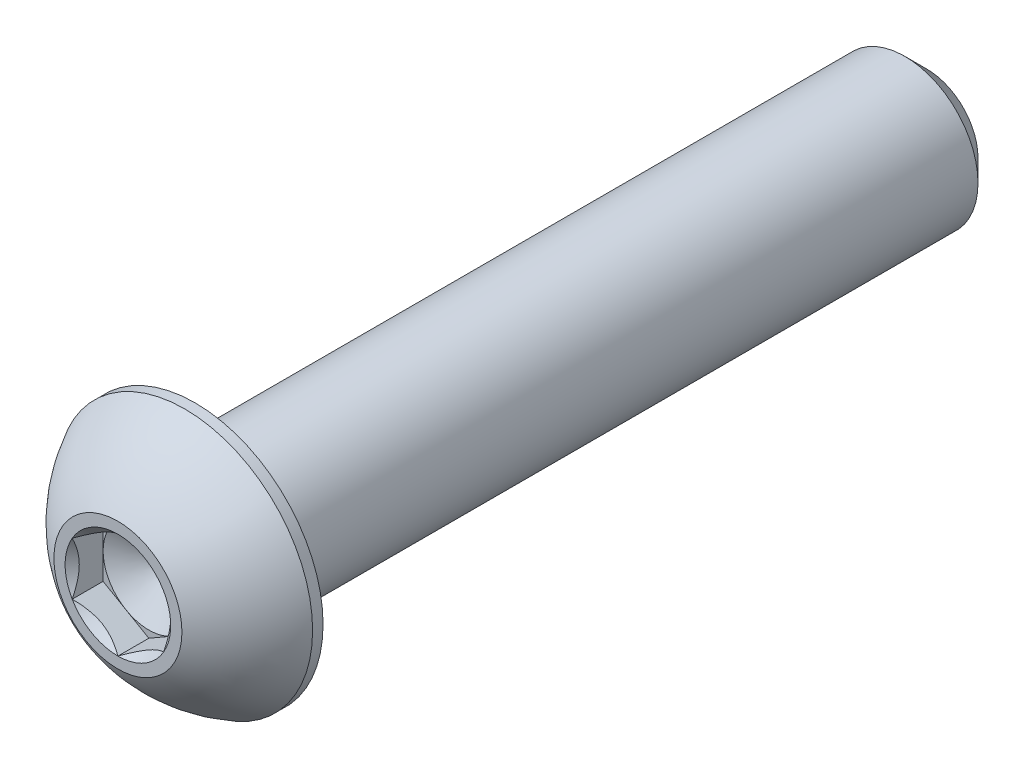
ISO-10303-21;
HEADER;
FILE_DESCRIPTION(('STEP AP214'),'2;1');
FILE_NAME('part.step','',(''),(''),'','','');
FILE_SCHEMA(('AUTOMOTIVE_DESIGN { 1 0 10303 214 1 1 1 1 }'));
ENDSEC;
DATA;
#1=APPLICATION_CONTEXT('core data for automotive mechanical design processes');
#2=APPLICATION_PROTOCOL_DEFINITION('international standard','automotive_design',2000,#1);
#3=PRODUCT_CONTEXT('',#1,'mechanical');
#4=PRODUCT('Part','Part','',(#3));
#5=PRODUCT_RELATED_PRODUCT_CATEGORY('part','',(#4));
#6=PRODUCT_DEFINITION_FORMATION('','',#4);
#7=PRODUCT_DEFINITION_CONTEXT('part definition',#1,'design');
#8=PRODUCT_DEFINITION('design','',#6,#7);
#9=PRODUCT_DEFINITION_SHAPE('','',#8);
#10=(LENGTH_UNIT() NAMED_UNIT(*) SI_UNIT(.MILLI.,.METRE.));
#11=(NAMED_UNIT(*) PLANE_ANGLE_UNIT() SI_UNIT($,.RADIAN.));
#12=(NAMED_UNIT(*) SI_UNIT($,.STERADIAN.) SOLID_ANGLE_UNIT());
#13=UNCERTAINTY_MEASURE_WITH_UNIT(LENGTH_MEASURE(1.E-05),#10,'distance_accuracy_value','');
#14=(GEOMETRIC_REPRESENTATION_CONTEXT(3) GLOBAL_UNCERTAINTY_ASSIGNED_CONTEXT((#13)) GLOBAL_UNIT_ASSIGNED_CONTEXT((#10,
#11,#12)) REPRESENTATION_CONTEXT('',''));
#15=CARTESIAN_POINT('',(0.,0.,0.));
#16=DIRECTION('',(0.,0.,1.));
#17=DIRECTION('',(1.,0.,0.));
#18=AXIS2_PLACEMENT_3D('',#15,#16,#17);
#19=CARTESIAN_POINT('',(0.,1.984375,17.5514));
#20=DIRECTION('',(0.,0.,-1.));
#21=DIRECTION('',(-1.,0.,0.));
#22=AXIS2_PLACEMENT_3D('',#19,#20,#21);
#23=PLANE('',#22);
#24=CARTESIAN_POINT('',(0.,0.,17.5514));
#25=DIRECTION('',(0.,0.,1.));
#26=DIRECTION('',(1.,0.,0.));
#27=AXIS2_PLACEMENT_3D('',#24,#25,#26);
#28=CIRCLE('',#27,2.778125);
#29=CARTESIAN_POINT('',(2.778125,0.,17.5514));
#30=VERTEX_POINT('',#29);
#31=EDGE_CURVE('E171',#30,#30,#28,.T.);
#32=ORIENTED_EDGE('',*,*,#31,.T.);
#33=EDGE_LOOP('',(#32));
#34=FACE_BOUND('',#33,.T.);
#35=CARTESIAN_POINT('',(0.,0.,17.5514));
#36=DIRECTION('',(0.,0.,1.));
#37=DIRECTION('',(1.,0.,0.));
#38=AXIS2_PLACEMENT_3D('',#35,#36,#37);
#39=CIRCLE('',#38,2.29135888084633);
#40=CARTESIAN_POINT('',(0.,2.29135888084633,17.5514));
#41=VERTEX_POINT('',#40);
#42=CARTESIAN_POINT('',(-1.984375,1.14567944042316,17.5514));
#43=VERTEX_POINT('',#42);
#44=EDGE_CURVE('E125',#41,#43,#39,.T.);
#45=ORIENTED_EDGE('',*,*,#44,.F.);
#46=CARTESIAN_POINT('',(0.,0.,17.5514));
#47=DIRECTION('',(0.,0.,1.));
#48=DIRECTION('',(1.,0.,0.));
#49=AXIS2_PLACEMENT_3D('',#46,#47,#48);
#50=CIRCLE('',#49,2.29135888084633);
#51=CARTESIAN_POINT('',(1.984375,1.14567944042317,17.5514));
#52=VERTEX_POINT('',#51);
#53=EDGE_CURVE('E110',#52,#41,#50,.T.);
#54=ORIENTED_EDGE('',*,*,#53,.F.);
#55=CARTESIAN_POINT('',(0.,0.,17.5514));
#56=DIRECTION('',(0.,0.,1.));
#57=DIRECTION('',(1.,0.,0.));
#58=AXIS2_PLACEMENT_3D('',#55,#56,#57);
#59=CIRCLE('',#58,2.29135888084633);
#60=CARTESIAN_POINT('',(1.984375,-1.14567944042317,17.5514));
#61=VERTEX_POINT('',#60);
#62=EDGE_CURVE('E121',#61,#52,#59,.T.);
#63=ORIENTED_EDGE('',*,*,#62,.F.);
#64=CARTESIAN_POINT('',(0.,0.,17.5514));
#65=DIRECTION('',(0.,0.,1.));
#66=DIRECTION('',(1.,0.,0.));
#67=AXIS2_PLACEMENT_3D('',#64,#65,#66);
#68=CIRCLE('',#67,2.29135888084633);
#69=CARTESIAN_POINT('',(0.,-2.29135888084633,17.5514));
#70=VERTEX_POINT('',#69);
#71=EDGE_CURVE('E142',#70,#61,#68,.T.);
#72=ORIENTED_EDGE('',*,*,#71,.F.);
#73=CARTESIAN_POINT('',(0.,0.,17.5514));
#74=DIRECTION('',(0.,0.,1.));
#75=DIRECTION('',(1.,0.,0.));
#76=AXIS2_PLACEMENT_3D('',#73,#74,#75);
#77=CIRCLE('',#76,2.29135888084633);
#78=CARTESIAN_POINT('',(-1.984375,-1.14567944042316,17.5514));
#79=VERTEX_POINT('',#78);
#80=EDGE_CURVE('E398',#79,#70,#77,.T.);
#81=ORIENTED_EDGE('',*,*,#80,.F.);
#82=CARTESIAN_POINT('',(0.,0.,17.5514));
#83=DIRECTION('',(0.,0.,1.));
#84=DIRECTION('',(1.,0.,0.));
#85=AXIS2_PLACEMENT_3D('',#82,#83,#84);
#86=CIRCLE('',#85,2.29135888084633);
#87=EDGE_CURVE('E407',#43,#79,#86,.T.);
#88=ORIENTED_EDGE('',*,*,#87,.F.);
#89=EDGE_LOOP('',(#45,#54,#63,#72,#81,#88));
#90=FACE_BOUND('',#89,.T.);
#91=ADVANCED_FACE('F37',(#34,#90),#23,.F.);
#92=CARTESIAN_POINT('',(0.,0.,-17.5514));
#93=DIRECTION('',(0.,0.,1.));
#94=DIRECTION('',(1.,0.,0.));
#95=AXIS2_PLACEMENT_3D('',#92,#93,#94);
#96=CONICAL_SURFACE('',#95,2.2225,0.785398163397446);
#97=CARTESIAN_POINT('',(0.,0.,-16.5989));
#98=DIRECTION('',(0.,0.,1.));
#99=DIRECTION('',(1.,0.,0.));
#100=AXIS2_PLACEMENT_3D('',#97,#98,#99);
#101=CIRCLE('',#100,3.175);
#102=CARTESIAN_POINT('',(3.175,0.,-16.5989));
#103=VERTEX_POINT('',#102);
#104=EDGE_CURVE('E11',#103,#103,#101,.T.);
#105=ORIENTED_EDGE('',*,*,#104,.F.);
#106=EDGE_LOOP('',(#105));
#107=FACE_BOUND('',#106,.T.);
#108=CARTESIAN_POINT('',(0.,0.,-17.5514));
#109=DIRECTION('',(0.,0.,1.));
#110=DIRECTION('',(1.,0.,0.));
#111=AXIS2_PLACEMENT_3D('',#108,#109,#110);
#112=CIRCLE('',#111,2.2225);
#113=CARTESIAN_POINT('',(2.2225,0.,-17.5514));
#114=VERTEX_POINT('',#113);
#115=EDGE_CURVE('E164',#114,#114,#112,.T.);
#116=ORIENTED_EDGE('',*,*,#115,.T.);
#117=EDGE_LOOP('',(#116));
#118=FACE_BOUND('',#117,.T.);
#119=ADVANCED_FACE('F39',(#107,#118),#96,.T.);
#120=CARTESIAN_POINT('',(0.,0.,17.5514));
#121=DIRECTION('',(0.,0.,1.));
#122=DIRECTION('',(1.,0.,0.));
#123=AXIS2_PLACEMENT_3D('',#120,#121,#122);
#124=CYLINDRICAL_SURFACE('',#123,3.175);
#125=CARTESIAN_POINT('',(0.,0.,14.1986));
#126=DIRECTION('',(0.,0.,1.));
#127=DIRECTION('',(1.,0.,0.));
#128=AXIS2_PLACEMENT_3D('',#125,#126,#127);
#129=CIRCLE('',#128,3.175);
#130=CARTESIAN_POINT('',(3.175,0.,14.1986));
#131=VERTEX_POINT('',#130);
#132=EDGE_CURVE('E45',#131,#131,#129,.T.);
#133=ORIENTED_EDGE('',*,*,#132,.F.);
#134=EDGE_LOOP('',(#133));
#135=FACE_BOUND('',#134,.T.);
#136=ORIENTED_EDGE('',*,*,#104,.T.);
#137=EDGE_LOOP('',(#136));
#138=FACE_BOUND('',#137,.T.);
#139=ADVANCED_FACE('F185',(#135,#138),#124,.T.);
#140=CARTESIAN_POINT('',(0.,5.5499,14.1986));
#141=DIRECTION('',(0.,0.,1.));
#142=DIRECTION('',(1.,0.,0.));
#143=AXIS2_PLACEMENT_3D('',#140,#141,#142);
#144=PLANE('',#143);
#145=CARTESIAN_POINT('',(0.,0.,14.1986));
#146=DIRECTION('',(0.,0.,1.));
#147=DIRECTION('',(1.,0.,0.));
#148=AXIS2_PLACEMENT_3D('',#145,#146,#147);
#149=CIRCLE('',#148,5.5499);
#150=CARTESIAN_POINT('',(5.5499,0.,14.1986));
#151=VERTEX_POINT('',#150);
#152=EDGE_CURVE('E178',#151,#151,#149,.T.);
#153=ORIENTED_EDGE('',*,*,#152,.F.);
#154=EDGE_LOOP('',(#153));
#155=FACE_BOUND('',#154,.T.);
#156=ORIENTED_EDGE('',*,*,#132,.T.);
#157=EDGE_LOOP('',(#156));
#158=FACE_BOUND('',#157,.T.);
#159=ADVANCED_FACE('F183',(#155,#158),#144,.F.);
#160=CARTESIAN_POINT('',(0.,0.,17.5514));
#161=DIRECTION('',(0.,0.,1.));
#162=DIRECTION('',(1.,0.,0.));
#163=AXIS2_PLACEMENT_3D('',#160,#161,#162);
#164=CYLINDRICAL_SURFACE('',#163,5.5499);
#165=CARTESIAN_POINT('',(0.,0.,14.6521714285714));
#166=DIRECTION('',(0.,0.,1.));
#167=DIRECTION('',(1.,0.,0.));
#168=AXIS2_PLACEMENT_3D('',#165,#166,#167);
#169=CIRCLE('',#168,5.5499);
#170=CARTESIAN_POINT('',(5.5499,0.,14.6521714285714));
#171=VERTEX_POINT('',#170);
#172=EDGE_CURVE('E175',#171,#171,#169,.T.);
#173=ORIENTED_EDGE('',*,*,#172,.F.);
#174=EDGE_LOOP('',(#173));
#175=FACE_BOUND('',#174,.T.);
#176=ORIENTED_EDGE('',*,*,#152,.T.);
#177=EDGE_LOOP('',(#176));
#178=FACE_BOUND('',#177,.T.);
#179=ADVANCED_FACE('F205',(#175,#178),#164,.T.);
#180=CARTESIAN_POINT('',(0.,0.,11.3585738300144));
#181=DIRECTION('',(0.,0.,1.));
#182=DIRECTION('',(1.,0.,0.));
#183=AXIS2_PLACEMENT_3D('',#180,#181,#182);
#184=DEGENERATE_TOROIDAL_SURFACE('',#183,0.797304856285756,7.1508597125715,.F.);
#185=ORIENTED_EDGE('',*,*,#31,.F.);
#186=EDGE_LOOP('',(#185));
#187=FACE_BOUND('',#186,.T.);
#188=ORIENTED_EDGE('',*,*,#172,.T.);
#189=EDGE_LOOP('',(#188));
#190=FACE_BOUND('',#189,.T.);
#191=ADVANCED_FACE('F196',(#187,#190),#184,.F.);
#192=CARTESIAN_POINT('',(0.,2.2225,-17.5514));
#193=DIRECTION('',(0.,0.,1.));
#194=DIRECTION('',(1.,0.,0.));
#195=AXIS2_PLACEMENT_3D('',#192,#193,#194);
#196=PLANE('',#195);
#197=ORIENTED_EDGE('',*,*,#115,.F.);
#198=EDGE_LOOP('',(#197));
#199=FACE_BOUND('',#198,.T.);
#200=ADVANCED_FACE('F194',(#199),#196,.F.);
#201=CARTESIAN_POINT('',(1.984375,1.14567944042317,17.5514));
#202=DIRECTION('',(-0.499999999999999,-0.866025403784439,0.));
#203=DIRECTION('',(0.866025403784439,-0.499999999999999,0.));
#204=AXIS2_PLACEMENT_3D('',#201,#202,#203);
#205=PLANE('',#204);
#206=CARTESIAN_POINT('',(1.984575,1.14556397036933,17.5515154787818));
#207=CARTESIAN_POINT('',(1.9163590048332,1.18494849354192,17.5121628522639));
#208=CARTESIAN_POINT('',(1.84700231489303,1.22499159714897,17.4751213104462));
#209=CARTESIAN_POINT('',(1.70557619954781,1.30664400291398,17.4072988584233));
#210=CARTESIAN_POINT('',(1.63349332126322,1.34826107209555,17.3765556890918));
#211=CARTESIAN_POINT('',(1.48814160273399,1.43217992591557,17.3238918888112));
#212=CARTESIAN_POINT('',(1.41490978751306,1.47446033414663,17.30183887588));
#213=CARTESIAN_POINT('',(1.26683381740529,1.55995203534886,17.2678614929439));
#214=CARTESIAN_POINT('',(1.19199418724658,1.60316071596705,17.2559117560917));
#215=CARTESIAN_POINT('',(1.06301458545618,1.6776271237807,17.2451300990819));
#216=CARTESIAN_POINT('',(1.00904128422756,1.7087886237741,17.2435338990591));
#217=CARTESIAN_POINT('',(0.901182881480199,1.77106070163465,17.2462218388653));
#218=CARTESIAN_POINT('',(0.847297817514476,1.80217125782056,17.2505080403405));
#219=CARTESIAN_POINT('',(0.740036461751395,1.86409863044402,17.2647168730135));
#220=CARTESIAN_POINT('',(0.686660807239859,1.89491507894443,17.2746458104523));
#221=CARTESIAN_POINT('',(0.580832482591103,1.95601509066827,17.2995950842745));
#222=CARTESIAN_POINT('',(0.528379742028898,1.9862986945516,17.3146150303895));
#223=CARTESIAN_POINT('',(0.394017661036351,2.06387267818152,17.3592078516357));
#224=CARTESIAN_POINT('',(0.312941642841675,2.11068193911104,17.3921429959383));
#225=CARTESIAN_POINT('',(0.193726693270158,2.17951072233758,17.4477424412022));
#226=CARTESIAN_POINT('',(0.154440075613996,2.20219286161692,17.4672775920519));
#227=CARTESIAN_POINT('',(0.0765946381319447,2.24713694590237,17.5081287381194));
#228=CARTESIAN_POINT('',(0.0380353888982992,2.26939913882716,17.5294436395683));
#229=CARTESIAN_POINT('',(-0.000200000000001396,2.29147435090016,17.5515154787818));
#230=B_SPLINE_CURVE_WITH_KNOTS('',3,(#206,#207,#208,#209,#210,#211,#212,#213,#214,#215,#216,
#217,#218,#219,#220,#221,#222,#223,#224,#225,#226,#227,#228,#229),.UNSPECIFIED.,.F.,.F.,(4,2,2,
2,2,2,2,2,2,2,2,4),(0.,0.264339630306627,0.530219665093694,0.791876416371458,1.05287424418109,
1.239639843932,1.42647091743852,1.61351120244034,1.8005371524754,2.09764209964316,
2.24579179873714,2.39385111134157),.UNSPECIFIED.);
#231=EDGE_CURVE('E107',#52,#41,#230,.T.);
#232=ORIENTED_EDGE('',*,*,#231,.T.);
#233=DIRECTION('',(0.,0.,-1.));
#234=VECTOR('',#233,1.);
#235=CARTESIAN_POINT('',(0.,2.29135888084633,17.5514));
#236=LINE('',#235,#234);
#237=CARTESIAN_POINT('',(0.,2.29135888084633,16.21028));
#238=VERTEX_POINT('',#237);
#239=EDGE_CURVE('E162',#41,#238,#236,.T.);
#240=ORIENTED_EDGE('',*,*,#239,.T.);
#241=DIRECTION('',(-0.866025403784439,0.499999999999999,0.));
#242=VECTOR('',#241,1.);
#243=CARTESIAN_POINT('',(1.984375,1.14567944042317,16.21028));
#244=LINE('',#243,#242);
#245=CARTESIAN_POINT('',(0.992187499999998,1.71851916063475,16.21028));
#246=VERTEX_POINT('',#245);
#247=EDGE_CURVE('E434',#246,#238,#244,.T.);
#248=ORIENTED_EDGE('',*,*,#247,.F.);
#249=CARTESIAN_POINT('',(1.984375,1.14567944042317,16.21028));
#250=VERTEX_POINT('',#249);
#251=EDGE_CURVE('E52',#250,#246,#244,.T.);
#252=ORIENTED_EDGE('',*,*,#251,.F.);
#253=DIRECTION('',(0.,0.,-1.));
#254=VECTOR('',#253,1.);
#255=CARTESIAN_POINT('',(1.984375,1.14567944042317,17.5514));
#256=LINE('',#255,#254);
#257=EDGE_CURVE('E138',#52,#250,#256,.T.);
#258=ORIENTED_EDGE('',*,*,#257,.F.);
#259=EDGE_LOOP('',(#232,#240,#248,#252,#258));
#260=FACE_BOUND('',#259,.T.);
#261=ADVANCED_FACE('F144',(#260),#205,.T.);
#262=CARTESIAN_POINT('',(0.,2.29135888084633,17.5514));
#263=DIRECTION('',(0.5,-0.866025403784438,0.));
#264=DIRECTION('',(0.866025403784438,0.5,0.));
#265=AXIS2_PLACEMENT_3D('',#262,#263,#264);
#266=PLANE('',#265);
#267=CARTESIAN_POINT('',(0.000199999999998332,2.29147435090016,17.5515154787818));
#268=CARTESIAN_POINT('',(-0.0680159951668041,2.25208982772757,17.5121628522639));
#269=CARTESIAN_POINT('',(-0.137372685106968,2.21204672412052,17.4751213104462));
#270=CARTESIAN_POINT('',(-0.278798800452189,2.13039431835551,17.4072988584233));
#271=CARTESIAN_POINT('',(-0.350881678736784,2.08877724917394,17.3765556890918));
#272=CARTESIAN_POINT('',(-0.496233397266005,2.00485839535392,17.3238918888112));
#273=CARTESIAN_POINT('',(-0.569465212486939,1.96257798712287,17.30183887588));
#274=CARTESIAN_POINT('',(-0.717541182594706,1.87708628592063,17.2678614929439));
#275=CARTESIAN_POINT('',(-0.792380812753424,1.83387760530244,17.2559117560917));
#276=CARTESIAN_POINT('',(-0.921360414543815,1.75941119748879,17.2451300990819));
#277=CARTESIAN_POINT('',(-0.975333715772442,1.72824969749539,17.2435338990591));
#278=CARTESIAN_POINT('',(-1.0831921185198,1.66597761963484,17.2462218388653));
#279=CARTESIAN_POINT('',(-1.13707718248552,1.63486706344893,17.2505080403405));
#280=CARTESIAN_POINT('',(-1.2443385382486,1.57293969082547,17.2647168730135));
#281=CARTESIAN_POINT('',(-1.29771419276014,1.54212324232506,17.2746458104523));
#282=CARTESIAN_POINT('',(-1.4035425174089,1.48102323060122,17.2995950842745));
#283=CARTESIAN_POINT('',(-1.4559952579711,1.45073962671789,17.3146150303895));
#284=CARTESIAN_POINT('',(-1.59035733896365,1.37316564308797,17.3592078516357));
#285=CARTESIAN_POINT('',(-1.67143335715832,1.32635638215845,17.3921429959383));
#286=CARTESIAN_POINT('',(-1.79064830672984,1.25752759893191,17.4477424412022));
#287=CARTESIAN_POINT('',(-1.829934924386,1.23484545965257,17.4672775920519));
#288=CARTESIAN_POINT('',(-1.90778036186805,1.18990137536712,17.5081287381194));
#289=CARTESIAN_POINT('',(-1.9463396111017,1.16763918244233,17.5294436395683));
#290=CARTESIAN_POINT('',(-1.984575,1.14556397036933,17.5515154787818));
#291=B_SPLINE_CURVE_WITH_KNOTS('',3,(#267,#268,#269,#270,#271,#272,#273,#274,#275,#276,#277,
#278,#279,#280,#281,#282,#283,#284,#285,#286,#287,#288,#289,#290),.UNSPECIFIED.,.F.,.F.,(4,2,2,
2,2,2,2,2,2,2,2,4),(0.,0.264339630306627,0.530219665093694,0.791876416371458,1.05287424418109,
1.239639843932,1.42647091743852,1.61351120244034,1.8005371524754,2.09764209964316,
2.24579179873714,2.39385111134157),.UNSPECIFIED.);
#292=EDGE_CURVE('E422',#41,#43,#291,.T.);
#293=ORIENTED_EDGE('',*,*,#292,.T.);
#294=DIRECTION('',(0.,0.,-1.));
#295=VECTOR('',#294,1.);
#296=CARTESIAN_POINT('',(-1.984375,1.14567944042316,17.5514));
#297=LINE('',#296,#295);
#298=CARTESIAN_POINT('',(-1.984375,1.14567944042316,16.21028));
#299=VERTEX_POINT('',#298);
#300=EDGE_CURVE('E159',#43,#299,#297,.T.);
#301=ORIENTED_EDGE('',*,*,#300,.T.);
#302=DIRECTION('',(-0.866025403784438,-0.5,0.));
#303=VECTOR('',#302,1.);
#304=CARTESIAN_POINT('',(0.,2.29135888084633,16.21028));
#305=LINE('',#304,#303);
#306=CARTESIAN_POINT('',(-0.992187500000001,1.71851916063475,16.21028));
#307=VERTEX_POINT('',#306);
#308=EDGE_CURVE('E436',#307,#299,#305,.T.);
#309=ORIENTED_EDGE('',*,*,#308,.F.);
#310=EDGE_CURVE('E437',#238,#307,#305,.T.);
#311=ORIENTED_EDGE('',*,*,#310,.F.);
#312=ORIENTED_EDGE('',*,*,#239,.F.);
#313=EDGE_LOOP('',(#293,#301,#309,#311,#312));
#314=FACE_BOUND('',#313,.T.);
#315=ADVANCED_FACE('F203',(#314),#266,.T.);
#316=CARTESIAN_POINT('',(-1.984375,1.14567944042316,17.5514));
#317=DIRECTION('',(1.,0.,0.));
#318=DIRECTION('',(0.,1.,0.));
#319=AXIS2_PLACEMENT_3D('',#316,#317,#318);
#320=PLANE('',#319);
#321=CARTESIAN_POINT('',(-1.984375,-2.24664989492636,18.2575700833169));
#322=CARTESIAN_POINT('',(-1.984375,-2.19177035879913,18.2164466992886));
#323=CARTESIAN_POINT('',(-1.984375,-2.1365793309425,18.1757329661326));
#324=CARTESIAN_POINT('',(-1.984375,-2.0254530694156,18.0953048670618));
#325=CARTESIAN_POINT('',(-1.984375,-1.96951764844329,18.0555907602265));
#326=CARTESIAN_POINT('',(-1.984375,-1.85637247000971,17.9770599960499));
#327=CARTESIAN_POINT('',(-1.984375,-1.79915619451491,17.9382526850202));
#328=CARTESIAN_POINT('',(-1.984375,-1.68374612486123,17.8621311665578));
#329=CARTESIAN_POINT('',(-1.984375,-1.62555240093272,17.8248168524981));
#330=CARTESIAN_POINT('',(-1.984375,-1.44283684202776,17.711567942359));
#331=CARTESIAN_POINT('',(-1.984375,-1.31636516124235,17.6387214191006));
#332=CARTESIAN_POINT('',(-1.984375,-1.05716498260296,17.5057117557776));
#333=CARTESIAN_POINT('',(-1.984375,-0.924459462264121,17.4455059196547));
#334=CARTESIAN_POINT('',(-1.984375,-0.724893074141588,17.3718618396154));
#335=CARTESIAN_POINT('',(-1.984375,-0.660907572248813,17.3506629174856));
#336=CARTESIAN_POINT('',(-1.984375,-0.531425551080248,17.3134071147974));
#337=CARTESIAN_POINT('',(-1.984375,-0.465928924835295,17.2973505994633));
#338=CARTESIAN_POINT('',(-1.984375,-0.334891945890406,17.2714708434592));
#339=CARTESIAN_POINT('',(-1.984375,-0.269372555502922,17.2615431015484));
#340=CARTESIAN_POINT('',(-1.984375,-0.137675185771462,17.2481085903106));
#341=CARTESIAN_POINT('',(-1.984375,-0.0714973135780643,17.2446007929468));
#342=CARTESIAN_POINT('',(-1.984375,0.0586431546448469,17.2442516482374));
#343=CARTESIAN_POINT('',(-1.984375,0.122605247687117,17.2471896245911));
#344=CARTESIAN_POINT('',(-1.984375,0.249962419599663,17.2590917091826));
#345=CARTESIAN_POINT('',(-1.984375,0.31335744162457,17.2680564148524));
#346=CARTESIAN_POINT('',(-1.984375,0.440194078343454,17.2916811503476));
#347=CARTESIAN_POINT('',(-1.984375,0.503617615772963,17.3064367997364));
#348=CARTESIAN_POINT('',(-1.984375,0.629083701047628,17.3408707574727));
#349=CARTESIAN_POINT('',(-1.984375,0.691126376772748,17.360548607898));
#350=CARTESIAN_POINT('',(-1.984375,0.888252191671361,17.4304251863326));
#351=CARTESIAN_POINT('',(-1.984375,1.02048040542614,17.4886555893404));
#352=CARTESIAN_POINT('',(-1.984375,1.27871806100266,17.6180691802767));
#353=CARTESIAN_POINT('',(-1.984375,1.40470281207755,17.6892992719574));
#354=CARTESIAN_POINT('',(-1.984375,1.5867785992022,17.8004129319412));
#355=CARTESIAN_POINT('',(-1.984375,1.64484387516128,17.8371238248926));
#356=CARTESIAN_POINT('',(-1.984375,1.75997827817988,17.9120874476375));
#357=CARTESIAN_POINT('',(-1.984375,1.81704732901583,17.9503402946748));
#358=CARTESIAN_POINT('',(-1.984375,1.92985499213403,18.0277867819938));
#359=CARTESIAN_POINT('',(-1.984375,1.98560066211377,18.0669701932287));
#360=CARTESIAN_POINT('',(-1.984375,2.09633159947626,18.1463666099261));
#361=CARTESIAN_POINT('',(-1.984375,2.15131707145808,18.1865793297131));
#362=CARTESIAN_POINT('',(-1.984375,2.20598450458982,18.22721347261));
#363=B_SPLINE_CURVE_WITH_KNOTS('',3,(#321,#322,#323,#324,#325,#326,#327,#328,#329,#330,#331,
#332,#333,#334,#335,#336,#337,#338,#339,#340,#341,#342,#343,#344,#345,#346,#347,#348,#349,#350,
#351,#352,#353,#354,#355,#356,#357,#358,#359,#360,#361,#362),.UNSPECIFIED.,.F.,.F.,(4,2,2,2,2,2,
2,2,2,2,2,2,2,2,2,2,2,2,2,2,4),(0.,0.205736210356766,0.411525204809811,0.618909845914798,
0.826279649489808,1.26374370453551,1.69970549535382,1.90175047418286,2.10380979948048,
2.30232110479859,2.50080061937433,2.69259135253523,2.88440110079441,3.07952109080018,
3.27462293514803,3.70679897011888,4.14056631296021,4.34663769336142,4.552724772271,
4.75712951108819,4.96147812147717),.UNSPECIFIED.);
#364=EDGE_CURVE('E415',#43,#79,#363,.F.);
#365=ORIENTED_EDGE('',*,*,#364,.T.);
#366=DIRECTION('',(0.,0.,-1.));
#367=VECTOR('',#366,1.);
#368=CARTESIAN_POINT('',(-1.984375,-1.14567944042316,17.5514));
#369=LINE('',#368,#367);
#370=CARTESIAN_POINT('',(-1.984375,-1.14567944042316,16.21028));
#371=VERTEX_POINT('',#370);
#372=EDGE_CURVE('E156',#79,#371,#369,.T.);
#373=ORIENTED_EDGE('',*,*,#372,.T.);
#374=DIRECTION('',(0.,-1.,0.));
#375=VECTOR('',#374,1.);
#376=CARTESIAN_POINT('',(-1.984375,1.14567944042316,16.21028));
#377=LINE('',#376,#375);
#378=CARTESIAN_POINT('',(-1.984375,0.,16.21028));
#379=VERTEX_POINT('',#378);
#380=EDGE_CURVE('E440',#379,#371,#377,.T.);
#381=ORIENTED_EDGE('',*,*,#380,.F.);
#382=EDGE_CURVE('E441',#299,#379,#377,.T.);
#383=ORIENTED_EDGE('',*,*,#382,.F.);
#384=ORIENTED_EDGE('',*,*,#300,.F.);
#385=EDGE_LOOP('',(#365,#373,#381,#383,#384));
#386=FACE_BOUND('',#385,.T.);
#387=ADVANCED_FACE('F258',(#386),#320,.T.);
#388=CARTESIAN_POINT('',(-1.984375,-1.14567944042316,17.5514));
#389=DIRECTION('',(0.5,0.866025403784439,0.));
#390=DIRECTION('',(-0.866025403784439,0.5,0.));
#391=AXIS2_PLACEMENT_3D('',#388,#389,#390);
#392=PLANE('',#391);
#393=CARTESIAN_POINT('',(-1.984575,-1.14556397036932,17.5515154787818));
#394=CARTESIAN_POINT('',(-1.9163590048332,-1.18494849354192,17.5121628522639));
#395=CARTESIAN_POINT('',(-1.84700231489303,-1.22499159714897,17.4751213104462));
#396=CARTESIAN_POINT('',(-1.70557619954781,-1.30664400291398,17.4072988584233));
#397=CARTESIAN_POINT('',(-1.63349332126322,-1.34826107209555,17.3765556890918));
#398=CARTESIAN_POINT('',(-1.48814160273399,-1.43217992591557,17.3238918888112));
#399=CARTESIAN_POINT('',(-1.41490978751306,-1.47446033414662,17.30183887588));
#400=CARTESIAN_POINT('',(-1.26683381740529,-1.55995203534886,17.2678614929439));
#401=CARTESIAN_POINT('',(-1.19199418724657,-1.60316071596705,17.2559117560917));
#402=CARTESIAN_POINT('',(-1.06301458545618,-1.6776271237807,17.2451300990819));
#403=CARTESIAN_POINT('',(-1.00904128422755,-1.7087886237741,17.2435338990591));
#404=CARTESIAN_POINT('',(-0.901182881480196,-1.77106070163465,17.2462218388653));
#405=CARTESIAN_POINT('',(-0.847297817514473,-1.80217125782056,17.2505080403405));
#406=CARTESIAN_POINT('',(-0.740036461751392,-1.86409863044402,17.2647168730135));
#407=CARTESIAN_POINT('',(-0.686660807239856,-1.89491507894443,17.2746458104523));
#408=CARTESIAN_POINT('',(-0.5808324825911,-1.95601509066827,17.2995950842745));
#409=CARTESIAN_POINT('',(-0.528379742028895,-1.9862986945516,17.3146150303895));
#410=CARTESIAN_POINT('',(-0.394017661036349,-2.06387267818152,17.3592078516357));
#411=CARTESIAN_POINT('',(-0.312941642841673,-2.11068193911104,17.3921429959383));
#412=CARTESIAN_POINT('',(-0.193726693270159,-2.17951072233758,17.4477424412022));
#413=CARTESIAN_POINT('',(-0.154440075613998,-2.20219286161692,17.4672775920519));
#414=CARTESIAN_POINT('',(-0.0765946381319472,-2.24713694590236,17.5081287381194));
#415=CARTESIAN_POINT('',(-0.0380353888983016,-2.26939913882716,17.5294436395683));
#416=CARTESIAN_POINT('',(0.000200000000000158,-2.29147435090016,17.5515154787818));
#417=B_SPLINE_CURVE_WITH_KNOTS('',3,(#393,#394,#395,#396,#397,#398,#399,#400,#401,#402,#403,
#404,#405,#406,#407,#408,#409,#410,#411,#412,#413,#414,#415,#416),.UNSPECIFIED.,.F.,.F.,(4,2,2,
2,2,2,2,2,2,2,2,4),(0.,0.264339630306627,0.530219665093696,0.791876416371463,1.0528742441811,
1.23963984393201,1.42647091743853,1.61351120244035,1.80053715247541,2.09764209964316,
2.24579179873714,2.39385111134157),.UNSPECIFIED.);
#418=EDGE_CURVE('E400',#79,#70,#417,.T.);
#419=ORIENTED_EDGE('',*,*,#418,.T.);
#420=DIRECTION('',(0.,0.,-1.));
#421=VECTOR('',#420,1.);
#422=CARTESIAN_POINT('',(0.,-2.29135888084632,17.5514));
#423=LINE('',#422,#421);
#424=CARTESIAN_POINT('',(0.,-2.29135888084632,16.21028));
#425=VERTEX_POINT('',#424);
#426=EDGE_CURVE('E147',#70,#425,#423,.T.);
#427=ORIENTED_EDGE('',*,*,#426,.T.);
#428=DIRECTION('',(0.866025403784439,-0.5,0.));
#429=VECTOR('',#428,1.);
#430=CARTESIAN_POINT('',(-1.984375,-1.14567944042316,16.21028));
#431=LINE('',#430,#429);
#432=CARTESIAN_POINT('',(-0.992187499999998,-1.71851916063474,16.21028));
#433=VERTEX_POINT('',#432);
#434=EDGE_CURVE('E444',#433,#425,#431,.T.);
#435=ORIENTED_EDGE('',*,*,#434,.F.);
#436=EDGE_CURVE('E445',#371,#433,#431,.T.);
#437=ORIENTED_EDGE('',*,*,#436,.F.);
#438=ORIENTED_EDGE('',*,*,#372,.F.);
#439=EDGE_LOOP('',(#419,#427,#435,#437,#438));
#440=FACE_BOUND('',#439,.T.);
#441=ADVANCED_FACE('F266',(#440),#392,.T.);
#442=CARTESIAN_POINT('',(0.,-2.29135888084632,17.5514));
#443=DIRECTION('',(-0.5,0.866025403784438,0.));
#444=DIRECTION('',(-0.866025403784438,-0.5,0.));
#445=AXIS2_PLACEMENT_3D('',#442,#443,#444);
#446=PLANE('',#445);
#447=CARTESIAN_POINT('',(-0.000199999999999107,-2.29147435090016,17.5515154787818));
#448=CARTESIAN_POINT('',(0.0680159951668038,-2.25208982772757,17.5121628522639));
#449=CARTESIAN_POINT('',(0.137372685106967,-2.21204672412052,17.4751213104462));
#450=CARTESIAN_POINT('',(0.278798800452189,-2.13039431835551,17.4072988584233));
#451=CARTESIAN_POINT('',(0.350881678736783,-2.08877724917393,17.3765556890917));
#452=CARTESIAN_POINT('',(0.496233397266004,-2.00485839535391,17.3238918888112));
#453=CARTESIAN_POINT('',(0.569465212486937,-1.96257798712286,17.30183887588));
#454=CARTESIAN_POINT('',(0.717541182594704,-1.87708628592063,17.2678614929439));
#455=CARTESIAN_POINT('',(0.792380812753422,-1.83387760530244,17.2559117560917));
#456=CARTESIAN_POINT('',(0.921360414543812,-1.75941119748879,17.2451300990819));
#457=CARTESIAN_POINT('',(0.975333715772439,-1.72824969749539,17.2435338990591));
#458=CARTESIAN_POINT('',(1.0831921185198,-1.66597761963484,17.2462218388653));
#459=CARTESIAN_POINT('',(1.13707718248552,-1.63486706344893,17.2505080403405));
#460=CARTESIAN_POINT('',(1.2443385382486,-1.57293969082547,17.2647168730135));
#461=CARTESIAN_POINT('',(1.29771419276014,-1.54212324232506,17.2746458104523));
#462=CARTESIAN_POINT('',(1.40354251740889,-1.48102323060121,17.2995950842745));
#463=CARTESIAN_POINT('',(1.4559952579711,-1.45073962671789,17.3146150303895));
#464=CARTESIAN_POINT('',(1.59035733896364,-1.37316564308797,17.3592078516357));
#465=CARTESIAN_POINT('',(1.67143335715832,-1.32635638215845,17.3921429959383));
#466=CARTESIAN_POINT('',(1.79064830672984,-1.2575275989319,17.4477424412022));
#467=CARTESIAN_POINT('',(1.829934924386,-1.23484545965257,17.4672775920519));
#468=CARTESIAN_POINT('',(1.90778036186805,-1.18990137536712,17.5081287381194));
#469=CARTESIAN_POINT('',(1.9463396111017,-1.16763918244233,17.5294436395683));
#470=CARTESIAN_POINT('',(1.984575,-1.14556397036932,17.5515154787818));
#471=B_SPLINE_CURVE_WITH_KNOTS('',3,(#447,#448,#449,#450,#451,#452,#453,#454,#455,#456,#457,
#458,#459,#460,#461,#462,#463,#464,#465,#466,#467,#468,#469,#470),.UNSPECIFIED.,.F.,.F.,(4,2,2,
2,2,2,2,2,2,2,2,4),(0.,0.264339630306628,0.530219665093694,0.791876416371457,1.05287424418109,
1.239639843932,1.42647091743852,1.61351120244034,1.8005371524754,2.09764209964316,
2.24579179873713,2.39385111134157),.UNSPECIFIED.);
#472=EDGE_CURVE('E391',#70,#61,#471,.T.);
#473=ORIENTED_EDGE('',*,*,#472,.T.);
#474=DIRECTION('',(0.,0.,-1.));
#475=VECTOR('',#474,1.);
#476=CARTESIAN_POINT('',(1.984375,-1.14567944042316,17.5514));
#477=LINE('',#476,#475);
#478=CARTESIAN_POINT('',(1.984375,-1.14567944042316,16.21028));
#479=VERTEX_POINT('',#478);
#480=EDGE_CURVE('E141',#61,#479,#477,.T.);
#481=ORIENTED_EDGE('',*,*,#480,.T.);
#482=DIRECTION('',(0.866025403784438,0.5,0.));
#483=VECTOR('',#482,1.);
#484=CARTESIAN_POINT('',(0.,-2.29135888084632,16.21028));
#485=LINE('',#484,#483);
#486=CARTESIAN_POINT('',(0.992187499999999,-1.71851916063474,16.21028));
#487=VERTEX_POINT('',#486);
#488=EDGE_CURVE('E447',#487,#479,#485,.T.);
#489=ORIENTED_EDGE('',*,*,#488,.F.);
#490=EDGE_CURVE('E448',#425,#487,#485,.T.);
#491=ORIENTED_EDGE('',*,*,#490,.F.);
#492=ORIENTED_EDGE('',*,*,#426,.F.);
#493=EDGE_LOOP('',(#473,#481,#489,#491,#492));
#494=FACE_BOUND('',#493,.T.);
#495=ADVANCED_FACE('F274',(#494),#446,.T.);
#496=CARTESIAN_POINT('',(1.984375,-1.14567944042316,17.5514));
#497=DIRECTION('',(-1.,0.,0.));
#498=DIRECTION('',(0.,-1.,0.));
#499=AXIS2_PLACEMENT_3D('',#496,#497,#498);
#500=PLANE('',#499);
#501=CARTESIAN_POINT('',(1.984375,-2.24664989492635,18.2575700833169));
#502=CARTESIAN_POINT('',(1.984375,-2.19177035879913,18.2164466992886));
#503=CARTESIAN_POINT('',(1.984375,-2.1365793309425,18.1757329661326));
#504=CARTESIAN_POINT('',(1.984375,-2.0254530694156,18.0953048670617));
#505=CARTESIAN_POINT('',(1.984375,-1.96951764844329,18.0555907602265));
#506=CARTESIAN_POINT('',(1.984375,-1.85637247000971,17.9770599960499));
#507=CARTESIAN_POINT('',(1.984375,-1.79915619451491,17.9382526850202));
#508=CARTESIAN_POINT('',(1.984375,-1.68374612486123,17.8621311665578));
#509=CARTESIAN_POINT('',(1.984375,-1.62555240093272,17.8248168524981));
#510=CARTESIAN_POINT('',(1.984375,-1.44283684202776,17.711567942359));
#511=CARTESIAN_POINT('',(1.984375,-1.31636516124235,17.6387214191006));
#512=CARTESIAN_POINT('',(1.984375,-1.05716498260296,17.5057117557776));
#513=CARTESIAN_POINT('',(1.984375,-0.92445946226412,17.4455059196546));
#514=CARTESIAN_POINT('',(1.984375,-0.724893074141585,17.3718618396154));
#515=CARTESIAN_POINT('',(1.984375,-0.66090757224881,17.3506629174856));
#516=CARTESIAN_POINT('',(1.984375,-0.531425551080244,17.3134071147974));
#517=CARTESIAN_POINT('',(1.984375,-0.465928924835292,17.2973505994633));
#518=CARTESIAN_POINT('',(1.984375,-0.334891945890403,17.2714708434592));
#519=CARTESIAN_POINT('',(1.984375,-0.269372555502919,17.2615431015484));
#520=CARTESIAN_POINT('',(1.984375,-0.137675185771459,17.2481085903106));
#521=CARTESIAN_POINT('',(1.984375,-0.0714973135780618,17.2446007929468));
#522=CARTESIAN_POINT('',(1.984375,0.0586431546448493,17.2442516482373));
#523=CARTESIAN_POINT('',(1.984375,0.12260524768712,17.2471896245911));
#524=CARTESIAN_POINT('',(1.984375,0.249962419599665,17.2590917091826));
#525=CARTESIAN_POINT('',(1.984375,0.313357441624572,17.2680564148524));
#526=CARTESIAN_POINT('',(1.984375,0.440194078343456,17.2916811503476));
#527=CARTESIAN_POINT('',(1.984375,0.503617615772965,17.3064367997364));
#528=CARTESIAN_POINT('',(1.984375,0.62908370104763,17.3408707574727));
#529=CARTESIAN_POINT('',(1.984375,0.691126376772749,17.360548607898));
#530=CARTESIAN_POINT('',(1.984375,0.888252191671363,17.4304251863326));
#531=CARTESIAN_POINT('',(1.984375,1.02048040542614,17.4886555893404));
#532=CARTESIAN_POINT('',(1.984375,1.27871806100267,17.6180691802767));
#533=CARTESIAN_POINT('',(1.984375,1.40470281207756,17.6892992719574));
#534=CARTESIAN_POINT('',(1.984375,1.5867785992022,17.8004129319412));
#535=CARTESIAN_POINT('',(1.984375,1.64484387516129,17.8371238248926));
#536=CARTESIAN_POINT('',(1.984375,1.75997827817988,17.9120874476375));
#537=CARTESIAN_POINT('',(1.984375,1.81704732901584,17.9503402946748));
#538=CARTESIAN_POINT('',(1.984375,1.92985499213404,18.0277867819938));
#539=CARTESIAN_POINT('',(1.984375,1.98560066211378,18.0669701932287));
#540=CARTESIAN_POINT('',(1.984375,2.09633159947627,18.1463666099261));
#541=CARTESIAN_POINT('',(1.984375,2.15131707145809,18.1865793297131));
#542=CARTESIAN_POINT('',(1.984375,2.20598450458983,18.22721347261));
#543=B_SPLINE_CURVE_WITH_KNOTS('',3,(#501,#502,#503,#504,#505,#506,#507,#508,#509,#510,#511,
#512,#513,#514,#515,#516,#517,#518,#519,#520,#521,#522,#523,#524,#525,#526,#527,#528,#529,#530,
#531,#532,#533,#534,#535,#536,#537,#538,#539,#540,#541,#542),.UNSPECIFIED.,.F.,.F.,(4,2,2,2,2,2,
2,2,2,2,2,2,2,2,2,2,2,2,2,2,4),(0.,0.205736210356763,0.411525204809806,0.618909845914794,
0.826279649489806,1.2637437045355,1.69970549535382,1.90175047418286,2.10380979948048,
2.30232110479859,2.50080061937432,2.69259135253523,2.88440110079441,3.07952109080017,
3.27462293514802,3.70679897011888,4.14056631296021,4.34663769336142,4.552724772271,
4.75712951108819,4.96147812147718),.UNSPECIFIED.);
#544=EDGE_CURVE('E131',#61,#52,#543,.T.);
#545=ORIENTED_EDGE('',*,*,#544,.T.);
#546=ORIENTED_EDGE('',*,*,#257,.T.);
#547=DIRECTION('',(0.,1.,0.));
#548=VECTOR('',#547,1.);
#549=CARTESIAN_POINT('',(1.984375,-1.14567944042316,16.21028));
#550=LINE('',#549,#548);
#551=CARTESIAN_POINT('',(1.984375,0.,16.21028));
#552=VERTEX_POINT('',#551);
#553=EDGE_CURVE('E150',#552,#250,#550,.T.);
#554=ORIENTED_EDGE('',*,*,#553,.F.);
#555=EDGE_CURVE('E145',#479,#552,#550,.T.);
#556=ORIENTED_EDGE('',*,*,#555,.F.);
#557=ORIENTED_EDGE('',*,*,#480,.F.);
#558=EDGE_LOOP('',(#545,#546,#554,#556,#557));
#559=FACE_BOUND('',#558,.T.);
#560=ADVANCED_FACE('F136',(#559),#500,.T.);
#561=CARTESIAN_POINT('',(0.,0.,16.21028));
#562=DIRECTION('',(0.,0.,1.));
#563=DIRECTION('',(1.,0.,0.));
#564=AXIS2_PLACEMENT_3D('',#561,#562,#563);
#565=PLANE('',#564);
#566=CARTESIAN_POINT('',(0.,0.,16.21028));
#567=DIRECTION('',(0.,0.,1.));
#568=DIRECTION('',(1.,0.,0.));
#569=AXIS2_PLACEMENT_3D('',#566,#567,#568);
#570=CIRCLE('',#569,1.984375);
#571=EDGE_CURVE('E167',#487,#552,#570,.T.);
#572=ORIENTED_EDGE('',*,*,#571,.F.);
#573=ORIENTED_EDGE('',*,*,#488,.T.);
#574=ORIENTED_EDGE('',*,*,#555,.T.);
#575=EDGE_LOOP('',(#572,#573,#574));
#576=FACE_BOUND('',#575,.T.);
#577=ADVANCED_FACE('F289',(#576),#565,.T.);
#578=EDGE_CURVE('E460',#433,#487,#570,.T.);
#579=ORIENTED_EDGE('',*,*,#578,.F.);
#580=ORIENTED_EDGE('',*,*,#434,.T.);
#581=ORIENTED_EDGE('',*,*,#490,.T.);
#582=EDGE_LOOP('',(#579,#580,#581));
#583=FACE_BOUND('',#582,.T.);
#584=ADVANCED_FACE('F296',(#583),#565,.T.);
#585=EDGE_CURVE('E461',#379,#433,#570,.T.);
#586=ORIENTED_EDGE('',*,*,#585,.F.);
#587=ORIENTED_EDGE('',*,*,#380,.T.);
#588=ORIENTED_EDGE('',*,*,#436,.T.);
#589=EDGE_LOOP('',(#586,#587,#588));
#590=FACE_BOUND('',#589,.T.);
#591=ADVANCED_FACE('F304',(#590),#565,.T.);
#592=EDGE_CURVE('E462',#307,#379,#570,.T.);
#593=ORIENTED_EDGE('',*,*,#592,.F.);
#594=ORIENTED_EDGE('',*,*,#308,.T.);
#595=ORIENTED_EDGE('',*,*,#382,.T.);
#596=EDGE_LOOP('',(#593,#594,#595));
#597=FACE_BOUND('',#596,.T.);
#598=ADVANCED_FACE('F311',(#597),#565,.T.);
#599=EDGE_CURVE('E172',#246,#307,#570,.T.);
#600=ORIENTED_EDGE('',*,*,#599,.F.);
#601=ORIENTED_EDGE('',*,*,#247,.T.);
#602=ORIENTED_EDGE('',*,*,#310,.T.);
#603=EDGE_LOOP('',(#600,#601,#602));
#604=FACE_BOUND('',#603,.T.);
#605=ADVANCED_FACE('F318',(#604),#565,.T.);
#606=EDGE_CURVE('E168',#552,#246,#570,.T.);
#607=ORIENTED_EDGE('',*,*,#606,.F.);
#608=ORIENTED_EDGE('',*,*,#553,.T.);
#609=ORIENTED_EDGE('',*,*,#251,.T.);
#610=EDGE_LOOP('',(#607,#608,#609));
#611=FACE_BOUND('',#610,.T.);
#612=ADVANCED_FACE('F242',(#611),#565,.T.);
#613=CARTESIAN_POINT('',(0.,0.,16.21028));
#614=DIRECTION('',(0.,0.,1.));
#615=DIRECTION('',(1.,0.,0.));
#616=AXIS2_PLACEMENT_3D('',#613,#614,#615);
#617=CONICAL_SURFACE('',#616,1.984375,1.0471975511966);
#618=CARTESIAN_POINT('',(0.,0.,15.0646005595768));
#619=VERTEX_POINT('',#618);
#620=VERTEX_LOOP('',#619);
#621=FACE_BOUND('',#620,.T.);
#622=ORIENTED_EDGE('',*,*,#606,.T.);
#623=ORIENTED_EDGE('',*,*,#599,.T.);
#624=ORIENTED_EDGE('',*,*,#592,.T.);
#625=ORIENTED_EDGE('',*,*,#585,.T.);
#626=ORIENTED_EDGE('',*,*,#578,.T.);
#627=ORIENTED_EDGE('',*,*,#571,.T.);
#628=EDGE_LOOP('',(#622,#623,#624,#625,#626,#627));
#629=FACE_BOUND('',#628,.T.);
#630=ADVANCED_FACE('F215',(#621,#629),#617,.F.);
#631=CARTESIAN_POINT('',(0.,0.,17.5514));
#632=DIRECTION('',(0.,0.,1.));
#633=DIRECTION('',(1.,0.,0.));
#634=AXIS2_PLACEMENT_3D('',#631,#632,#633);
#635=CONICAL_SURFACE('',#634,2.29135888084633,0.78539816339745);
#636=ORIENTED_EDGE('',*,*,#44,.T.);
#637=ORIENTED_EDGE('',*,*,#292,.F.);
#638=EDGE_LOOP('',(#636,#637));
#639=FACE_BOUND('',#638,.T.);
#640=ADVANCED_FACE('F241',(#639),#635,.F.);
#641=CARTESIAN_POINT('',(0.,0.,17.5514));
#642=DIRECTION('',(0.,0.,1.));
#643=DIRECTION('',(1.,0.,0.));
#644=AXIS2_PLACEMENT_3D('',#641,#642,#643);
#645=CONICAL_SURFACE('',#644,2.29135888084633,0.78539816339745);
#646=ORIENTED_EDGE('',*,*,#87,.T.);
#647=ORIENTED_EDGE('',*,*,#364,.F.);
#648=EDGE_LOOP('',(#646,#647));
#649=FACE_BOUND('',#648,.T.);
#650=ADVANCED_FACE('F334',(#649),#645,.F.);
#651=CARTESIAN_POINT('',(0.,0.,17.5514));
#652=DIRECTION('',(0.,0.,1.));
#653=DIRECTION('',(1.,0.,0.));
#654=AXIS2_PLACEMENT_3D('',#651,#652,#653);
#655=CONICAL_SURFACE('',#654,2.29135888084633,0.78539816339745);
#656=ORIENTED_EDGE('',*,*,#80,.T.);
#657=ORIENTED_EDGE('',*,*,#418,.F.);
#658=EDGE_LOOP('',(#656,#657));
#659=FACE_BOUND('',#658,.T.);
#660=ADVANCED_FACE('F342',(#659),#655,.F.);
#661=CARTESIAN_POINT('',(0.,0.,17.5514));
#662=DIRECTION('',(0.,0.,1.));
#663=DIRECTION('',(1.,0.,0.));
#664=AXIS2_PLACEMENT_3D('',#661,#662,#663);
#665=CONICAL_SURFACE('',#664,2.29135888084633,0.78539816339745);
#666=ORIENTED_EDGE('',*,*,#71,.T.);
#667=ORIENTED_EDGE('',*,*,#472,.F.);
#668=EDGE_LOOP('',(#666,#667));
#669=FACE_BOUND('',#668,.T.);
#670=ADVANCED_FACE('F350',(#669),#665,.F.);
#671=CARTESIAN_POINT('',(0.,0.,17.5514));
#672=DIRECTION('',(0.,0.,1.));
#673=DIRECTION('',(1.,0.,0.));
#674=AXIS2_PLACEMENT_3D('',#671,#672,#673);
#675=CONICAL_SURFACE('',#674,2.29135888084633,0.78539816339745);
#676=ORIENTED_EDGE('',*,*,#62,.T.);
#677=ORIENTED_EDGE('',*,*,#544,.F.);
#678=EDGE_LOOP('',(#676,#677));
#679=FACE_BOUND('',#678,.T.);
#680=ADVANCED_FACE('F130',(#679),#675,.F.);
#681=CARTESIAN_POINT('',(0.,0.,17.5514));
#682=DIRECTION('',(0.,0.,1.));
#683=DIRECTION('',(1.,0.,0.));
#684=AXIS2_PLACEMENT_3D('',#681,#682,#683);
#685=CONICAL_SURFACE('',#684,2.29135888084633,0.78539816339745);
#686=ORIENTED_EDGE('',*,*,#53,.T.);
#687=ORIENTED_EDGE('',*,*,#231,.F.);
#688=EDGE_LOOP('',(#686,#687));
#689=FACE_BOUND('',#688,.T.);
#690=ADVANCED_FACE('F109',(#689),#685,.F.);
#691=CLOSED_SHELL('',(#91,#119,#139,#159,#179,#191,#200,#261,#315,#387,#441,#495,#560,#577,#584,
#591,#598,#605,#612,#630,#640,#650,#660,#670,#680,#690));
#692=MANIFOLD_SOLID_BREP('B2',#691);
#693=ADVANCED_BREP_SHAPE_REPRESENTATION('',(#18,#692),#14);
#694=SHAPE_DEFINITION_REPRESENTATION(#9,#693);
ENDSEC;
END-ISO-10303-21;
